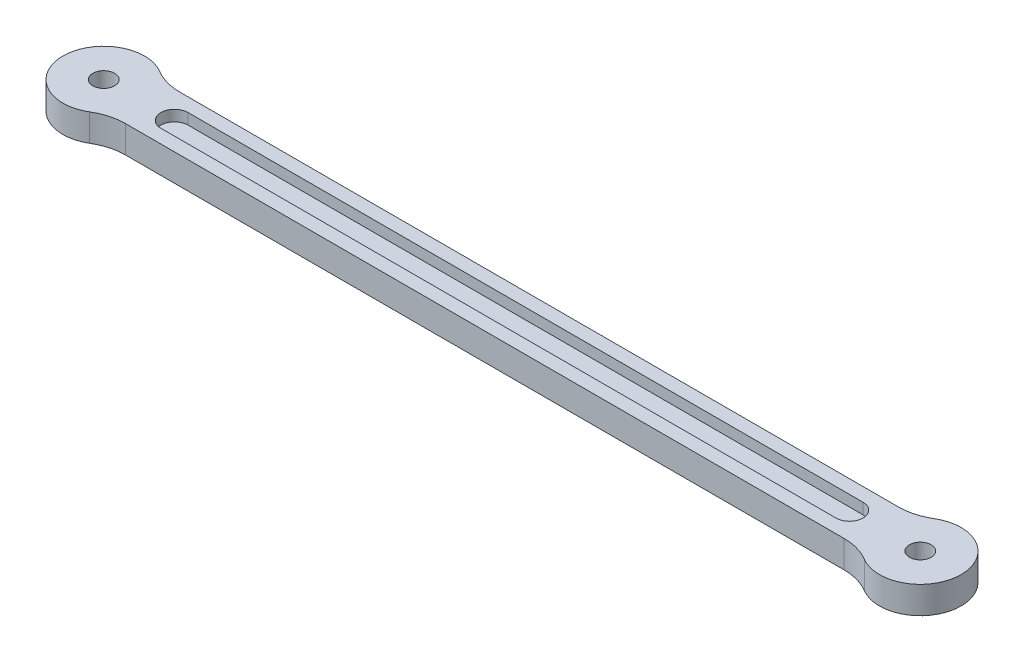
ISO-10303-21;
HEADER;
FILE_DESCRIPTION(('STEP AP214'),'2;1');
FILE_NAME('part.step','',(''),(''),'','','');
FILE_SCHEMA(('AUTOMOTIVE_DESIGN { 1 0 10303 214 1 1 1 1 }'));
ENDSEC;
DATA;
#1=APPLICATION_CONTEXT('core data for automotive mechanical design processes');
#2=APPLICATION_PROTOCOL_DEFINITION('international standard','automotive_design',2000,#1);
#3=PRODUCT_CONTEXT('',#1,'mechanical');
#4=PRODUCT('Part','Part','',(#3));
#5=PRODUCT_RELATED_PRODUCT_CATEGORY('part','',(#4));
#6=PRODUCT_DEFINITION_FORMATION('','',#4);
#7=PRODUCT_DEFINITION_CONTEXT('part definition',#1,'design');
#8=PRODUCT_DEFINITION('design','',#6,#7);
#9=PRODUCT_DEFINITION_SHAPE('','',#8);
#10=(LENGTH_UNIT() NAMED_UNIT(*) SI_UNIT(.MILLI.,.METRE.));
#11=(NAMED_UNIT(*) PLANE_ANGLE_UNIT() SI_UNIT($,.RADIAN.));
#12=(NAMED_UNIT(*) SI_UNIT($,.STERADIAN.) SOLID_ANGLE_UNIT());
#13=UNCERTAINTY_MEASURE_WITH_UNIT(LENGTH_MEASURE(1.E-05),#10,'distance_accuracy_value','');
#14=(GEOMETRIC_REPRESENTATION_CONTEXT(3) GLOBAL_UNCERTAINTY_ASSIGNED_CONTEXT((#13)) GLOBAL_UNIT_ASSIGNED_CONTEXT((#10,
#11,#12)) REPRESENTATION_CONTEXT('',''));
#15=CARTESIAN_POINT('',(0.,0.,0.));
#16=DIRECTION('',(0.,0.,1.));
#17=DIRECTION('',(1.,0.,0.));
#18=AXIS2_PLACEMENT_3D('',#15,#16,#17);
#19=CARTESIAN_POINT('',(63.2052229349355,5.,7.82303370786517));
#20=DIRECTION('',(0.,-1.,0.));
#21=DIRECTION('',(0.,0.,-1.));
#22=AXIS2_PLACEMENT_3D('',#19,#20,#21);
#23=PLANE('',#22);
#24=DIRECTION('',(1.,0.,0.));
#25=VECTOR('',#24,1.);
#26=CARTESIAN_POINT('',(-64.7808988764045,5.,-4.67696629213482));
#27=LINE('',#26,#25);
#28=CARTESIAN_POINT('',(-64.7808988764045,5.,-4.67696629213482));
#29=VERTEX_POINT('',#28);
#30=CARTESIAN_POINT('',(59.2191011235955,5.,-4.67696629213483));
#31=VERTEX_POINT('',#30);
#32=EDGE_CURVE('E225',#29,#31,#27,.T.);
#33=ORIENTED_EDGE('',*,*,#32,.F.);
#34=CARTESIAN_POINT('',(-64.7808988764045,5.,-7.17696629213483));
#35=DIRECTION('',(0.,1.,0.));
#36=DIRECTION('',(0.,0.,1.));
#37=AXIS2_PLACEMENT_3D('',#34,#35,#36);
#38=CIRCLE('',#37,2.50000000000001);
#39=CARTESIAN_POINT('',(-64.7808988764045,5.,-9.67696629213484));
#40=VERTEX_POINT('',#39);
#41=EDGE_CURVE('E52',#40,#29,#38,.T.);
#42=ORIENTED_EDGE('',*,*,#41,.F.);
#43=DIRECTION('',(-1.,0.,0.));
#44=VECTOR('',#43,1.);
#45=CARTESIAN_POINT('',(-64.7808988764045,5.,-9.67696629213484));
#46=LINE('',#45,#44);
#47=CARTESIAN_POINT('',(59.2191011235955,5.,-9.67696629213483));
#48=VERTEX_POINT('',#47);
#49=EDGE_CURVE('E218',#48,#40,#46,.T.);
#50=ORIENTED_EDGE('',*,*,#49,.F.);
#51=CARTESIAN_POINT('',(59.2191011235955,5.,-7.17696629213483));
#52=DIRECTION('',(0.,1.,0.));
#53=DIRECTION('',(0.,0.,1.));
#54=AXIS2_PLACEMENT_3D('',#51,#52,#53);
#55=CIRCLE('',#54,2.5);
#56=EDGE_CURVE('E222',#31,#48,#55,.T.);
#57=ORIENTED_EDGE('',*,*,#56,.F.);
#58=EDGE_LOOP('',(#33,#42,#50,#57));
#59=FACE_BOUND('',#58,.T.);
#60=CARTESIAN_POINT('',(63.2052229349355,5.,7.82303370786517));
#61=DIRECTION('',(0.,-1.,0.));
#62=DIRECTION('',(0.,0.,-1.));
#63=AXIS2_PLACEMENT_3D('',#60,#61,#62);
#64=CIRCLE('',#63,10.);
#65=CARTESIAN_POINT('',(63.2052229349355,5.,-2.17696629213483));
#66=VERTEX_POINT('',#65);
#67=CARTESIAN_POINT('',(68.3560104713126,5.,-0.748394863563402));
#68=VERTEX_POINT('',#67);
#69=EDGE_CURVE('E162',#66,#68,#64,.T.);
#70=ORIENTED_EDGE('',*,*,#69,.T.);
#71=CARTESIAN_POINT('',(72.2191011235955,5.,-7.17696629213483));
#72=DIRECTION('',(0.,1.,0.));
#73=DIRECTION('',(0.,0.,1.));
#74=AXIS2_PLACEMENT_3D('',#71,#72,#73);
#75=CIRCLE('',#74,7.5);
#76=CARTESIAN_POINT('',(68.3560104713126,5.,-13.6055377207063));
#77=VERTEX_POINT('',#76);
#78=EDGE_CURVE('E102',#68,#77,#75,.T.);
#79=ORIENTED_EDGE('',*,*,#78,.T.);
#80=CARTESIAN_POINT('',(63.2052229349355,5.,-22.1769662921348));
#81=DIRECTION('',(0.,-1.,0.));
#82=DIRECTION('',(0.,0.,1.));
#83=AXIS2_PLACEMENT_3D('',#80,#81,#82);
#84=CIRCLE('',#83,10.);
#85=CARTESIAN_POINT('',(63.2052229349355,5.,-12.1769662921348));
#86=VERTEX_POINT('',#85);
#87=EDGE_CURVE('E177',#77,#86,#84,.T.);
#88=ORIENTED_EDGE('',*,*,#87,.T.);
#89=DIRECTION('',(-1.,0.,0.));
#90=VECTOR('',#89,1.);
#91=CARTESIAN_POINT('',(-68.7670206877445,5.,-12.1769662921348));
#92=LINE('',#91,#90);
#93=CARTESIAN_POINT('',(-68.7670206877445,5.,-12.1769662921348));
#94=VERTEX_POINT('',#93);
#95=EDGE_CURVE('E190',#86,#94,#92,.T.);
#96=ORIENTED_EDGE('',*,*,#95,.T.);
#97=CARTESIAN_POINT('',(-68.7670206877445,5.,-22.1769662921348));
#98=DIRECTION('',(0.,-1.,0.));
#99=DIRECTION('',(0.,0.,-1.));
#100=AXIS2_PLACEMENT_3D('',#97,#98,#99);
#101=CIRCLE('',#100,10.);
#102=CARTESIAN_POINT('',(-73.9178082241217,5.,-13.6055377207063));
#103=VERTEX_POINT('',#102);
#104=EDGE_CURVE('E125',#94,#103,#101,.T.);
#105=ORIENTED_EDGE('',*,*,#104,.T.);
#106=CARTESIAN_POINT('',(-77.7808988764045,5.,-7.17696629213483));
#107=DIRECTION('',(0.,1.,0.));
#108=DIRECTION('',(0.,0.,1.));
#109=AXIS2_PLACEMENT_3D('',#106,#107,#108);
#110=CIRCLE('',#109,7.5);
#111=CARTESIAN_POINT('',(-73.9178082241217,5.,-0.748394863563404));
#112=VERTEX_POINT('',#111);
#113=EDGE_CURVE('E118',#103,#112,#110,.T.);
#114=ORIENTED_EDGE('',*,*,#113,.T.);
#115=CARTESIAN_POINT('',(-68.7670206877445,5.,7.82303370786517));
#116=DIRECTION('',(0.,-1.,0.));
#117=DIRECTION('',(0.,0.,1.));
#118=AXIS2_PLACEMENT_3D('',#115,#116,#117);
#119=CIRCLE('',#118,10.);
#120=CARTESIAN_POINT('',(-68.7670206877445,5.,-2.17696629213483));
#121=VERTEX_POINT('',#120);
#122=EDGE_CURVE('E122',#112,#121,#119,.T.);
#123=ORIENTED_EDGE('',*,*,#122,.T.);
#124=DIRECTION('',(1.,0.,0.));
#125=VECTOR('',#124,1.);
#126=CARTESIAN_POINT('',(-68.7670206877445,5.,-2.17696629213483));
#127=LINE('',#126,#125);
#128=EDGE_CURVE('E61',#121,#66,#127,.T.);
#129=ORIENTED_EDGE('',*,*,#128,.T.);
#130=EDGE_LOOP('',(#70,#79,#88,#96,#105,#114,#123,#129));
#131=FACE_BOUND('',#130,.T.);
#132=CARTESIAN_POINT('',(-77.7808988764045,5.,-7.17696629213483));
#133=DIRECTION('',(0.,1.,0.));
#134=DIRECTION('',(0.,0.,1.));
#135=AXIS2_PLACEMENT_3D('',#132,#133,#134);
#136=CIRCLE('',#135,2.);
#137=CARTESIAN_POINT('',(-77.7808988764045,5.,-5.17696629213483));
#138=VERTEX_POINT('',#137);
#139=EDGE_CURVE('E150',#138,#138,#136,.T.);
#140=ORIENTED_EDGE('',*,*,#139,.F.);
#141=EDGE_LOOP('',(#140));
#142=FACE_BOUND('',#141,.T.);
#143=CARTESIAN_POINT('',(72.2191011235955,5.,-7.17696629213483));
#144=DIRECTION('',(0.,1.,0.));
#145=DIRECTION('',(0.,0.,1.));
#146=AXIS2_PLACEMENT_3D('',#143,#144,#145);
#147=CIRCLE('',#146,2.);
#148=CARTESIAN_POINT('',(72.2191011235955,5.,-5.17696629213483));
#149=VERTEX_POINT('',#148);
#150=EDGE_CURVE('E199',#149,#149,#147,.T.);
#151=ORIENTED_EDGE('',*,*,#150,.F.);
#152=EDGE_LOOP('',(#151));
#153=FACE_BOUND('',#152,.T.);
#154=ADVANCED_FACE('F37',(#59,#131,#142,#153),#23,.F.);
#155=CARTESIAN_POINT('',(63.2052229349355,0.,7.82303370786517));
#156=DIRECTION('',(0.,-1.,0.));
#157=DIRECTION('',(0.,0.,-1.));
#158=AXIS2_PLACEMENT_3D('',#155,#156,#157);
#159=PLANE('',#158);
#160=CARTESIAN_POINT('',(-77.7808988764045,0.,-7.17696629213483));
#161=DIRECTION('',(0.,1.,0.));
#162=DIRECTION('',(0.,0.,1.));
#163=AXIS2_PLACEMENT_3D('',#160,#161,#162);
#164=CIRCLE('',#163,2.);
#165=CARTESIAN_POINT('',(-77.7808988764045,0.,-5.17696629213483));
#166=VERTEX_POINT('',#165);
#167=EDGE_CURVE('E196',#166,#166,#164,.T.);
#168=ORIENTED_EDGE('',*,*,#167,.T.);
#169=EDGE_LOOP('',(#168));
#170=FACE_BOUND('',#169,.T.);
#171=CARTESIAN_POINT('',(63.2052229349355,0.,7.82303370786517));
#172=DIRECTION('',(0.,-1.,0.));
#173=DIRECTION('',(0.,0.,-1.));
#174=AXIS2_PLACEMENT_3D('',#171,#172,#173);
#175=CIRCLE('',#174,10.);
#176=CARTESIAN_POINT('',(63.2052229349355,0.,-2.17696629213483));
#177=VERTEX_POINT('',#176);
#178=CARTESIAN_POINT('',(68.3560104713126,0.,-0.748394863563402));
#179=VERTEX_POINT('',#178);
#180=EDGE_CURVE('E146',#177,#179,#175,.T.);
#181=ORIENTED_EDGE('',*,*,#180,.F.);
#182=DIRECTION('',(1.,0.,0.));
#183=VECTOR('',#182,1.);
#184=CARTESIAN_POINT('',(-68.7670206877445,0.,-2.17696629213483));
#185=LINE('',#184,#183);
#186=CARTESIAN_POINT('',(-68.7670206877445,0.,-2.17696629213483));
#187=VERTEX_POINT('',#186);
#188=EDGE_CURVE('E94',#187,#177,#185,.T.);
#189=ORIENTED_EDGE('',*,*,#188,.F.);
#190=CARTESIAN_POINT('',(-68.7670206877445,0.,7.82303370786517));
#191=DIRECTION('',(0.,-1.,0.));
#192=DIRECTION('',(0.,0.,1.));
#193=AXIS2_PLACEMENT_3D('',#190,#191,#192);
#194=CIRCLE('',#193,10.);
#195=CARTESIAN_POINT('',(-73.9178082241217,0.,-0.748394863563404));
#196=VERTEX_POINT('',#195);
#197=EDGE_CURVE('E159',#196,#187,#194,.T.);
#198=ORIENTED_EDGE('',*,*,#197,.F.);
#199=CARTESIAN_POINT('',(-77.7808988764045,0.,-7.17696629213483));
#200=DIRECTION('',(0.,1.,0.));
#201=DIRECTION('',(0.,0.,1.));
#202=AXIS2_PLACEMENT_3D('',#199,#200,#201);
#203=CIRCLE('',#202,7.5);
#204=CARTESIAN_POINT('',(-73.9178082241217,0.,-13.6055377207063));
#205=VERTEX_POINT('',#204);
#206=EDGE_CURVE('E134',#205,#196,#203,.T.);
#207=ORIENTED_EDGE('',*,*,#206,.F.);
#208=CARTESIAN_POINT('',(-68.7670206877445,0.,-22.1769662921348));
#209=DIRECTION('',(0.,-1.,0.));
#210=DIRECTION('',(0.,0.,-1.));
#211=AXIS2_PLACEMENT_3D('',#208,#209,#210);
#212=CIRCLE('',#211,10.);
#213=CARTESIAN_POINT('',(-68.7670206877445,0.,-12.1769662921348));
#214=VERTEX_POINT('',#213);
#215=EDGE_CURVE('E156',#214,#205,#212,.T.);
#216=ORIENTED_EDGE('',*,*,#215,.F.);
#217=DIRECTION('',(-1.,0.,0.));
#218=VECTOR('',#217,1.);
#219=CARTESIAN_POINT('',(-68.7670206877445,0.,-12.1769662921348));
#220=LINE('',#219,#218);
#221=CARTESIAN_POINT('',(63.2052229349355,0.,-12.1769662921348));
#222=VERTEX_POINT('',#221);
#223=EDGE_CURVE('E154',#222,#214,#220,.T.);
#224=ORIENTED_EDGE('',*,*,#223,.F.);
#225=CARTESIAN_POINT('',(63.2052229349355,0.,-22.1769662921348));
#226=DIRECTION('',(0.,-1.,0.));
#227=DIRECTION('',(0.,0.,1.));
#228=AXIS2_PLACEMENT_3D('',#225,#226,#227);
#229=CIRCLE('',#228,10.);
#230=CARTESIAN_POINT('',(68.3560104713126,0.,-13.6055377207063));
#231=VERTEX_POINT('',#230);
#232=EDGE_CURVE('E152',#231,#222,#229,.T.);
#233=ORIENTED_EDGE('',*,*,#232,.F.);
#234=CARTESIAN_POINT('',(72.2191011235955,0.,-7.17696629213483));
#235=DIRECTION('',(0.,1.,0.));
#236=DIRECTION('',(0.,0.,1.));
#237=AXIS2_PLACEMENT_3D('',#234,#235,#236);
#238=CIRCLE('',#237,7.5);
#239=EDGE_CURVE('E149',#179,#231,#238,.T.);
#240=ORIENTED_EDGE('',*,*,#239,.F.);
#241=EDGE_LOOP('',(#181,#189,#198,#207,#216,#224,#233,#240));
#242=FACE_BOUND('',#241,.T.);
#243=CARTESIAN_POINT('',(72.2191011235955,0.,-7.17696629213483));
#244=DIRECTION('',(0.,1.,0.));
#245=DIRECTION('',(0.,0.,1.));
#246=AXIS2_PLACEMENT_3D('',#243,#244,#245);
#247=CIRCLE('',#246,2.);
#248=CARTESIAN_POINT('',(72.2191011235955,0.,-5.17696629213483));
#249=VERTEX_POINT('',#248);
#250=EDGE_CURVE('E202',#249,#249,#247,.T.);
#251=ORIENTED_EDGE('',*,*,#250,.T.);
#252=EDGE_LOOP('',(#251));
#253=FACE_BOUND('',#252,.T.);
#254=ADVANCED_FACE('F181',(#170,#242,#253),#159,.T.);
#255=CARTESIAN_POINT('',(63.2052229349355,5.,7.82303370786517));
#256=DIRECTION('',(0.,-1.,0.));
#257=DIRECTION('',(0.,0.,-1.));
#258=AXIS2_PLACEMENT_3D('',#255,#256,#257);
#259=CYLINDRICAL_SURFACE('',#258,10.);
#260=ORIENTED_EDGE('',*,*,#180,.T.);
#261=DIRECTION('',(0.,-1.,0.));
#262=VECTOR('',#261,1.);
#263=CARTESIAN_POINT('',(68.3560104713126,5.,-0.748394863563402));
#264=LINE('',#263,#262);
#265=EDGE_CURVE('E11',#68,#179,#264,.T.);
#266=ORIENTED_EDGE('',*,*,#265,.F.);
#267=ORIENTED_EDGE('',*,*,#69,.F.);
#268=DIRECTION('',(0.,-1.,0.));
#269=VECTOR('',#268,1.);
#270=CARTESIAN_POINT('',(63.2052229349355,5.,-2.17696629213483));
#271=LINE('',#270,#269);
#272=EDGE_CURVE('E142',#66,#177,#271,.T.);
#273=ORIENTED_EDGE('',*,*,#272,.T.);
#274=EDGE_LOOP('',(#260,#266,#267,#273));
#275=FACE_BOUND('',#274,.T.);
#276=ADVANCED_FACE('F39',(#275),#259,.F.);
#277=CARTESIAN_POINT('',(72.2191011235955,5.,-7.17696629213483));
#278=DIRECTION('',(0.,-1.,0.));
#279=DIRECTION('',(0.,0.,-1.));
#280=AXIS2_PLACEMENT_3D('',#277,#278,#279);
#281=CYLINDRICAL_SURFACE('',#280,7.5);
#282=ORIENTED_EDGE('',*,*,#239,.T.);
#283=DIRECTION('',(0.,-1.,0.));
#284=VECTOR('',#283,1.);
#285=CARTESIAN_POINT('',(68.3560104713126,5.,-13.6055377207063));
#286=LINE('',#285,#284);
#287=EDGE_CURVE('E45',#77,#231,#286,.T.);
#288=ORIENTED_EDGE('',*,*,#287,.F.);
#289=ORIENTED_EDGE('',*,*,#78,.F.);
#290=ORIENTED_EDGE('',*,*,#265,.T.);
#291=EDGE_LOOP('',(#282,#288,#289,#290));
#292=FACE_BOUND('',#291,.T.);
#293=ADVANCED_FACE('F300',(#292),#281,.T.);
#294=CARTESIAN_POINT('',(63.2052229349355,5.,-22.1769662921348));
#295=DIRECTION('',(0.,-1.,0.));
#296=DIRECTION('',(0.,0.,-1.));
#297=AXIS2_PLACEMENT_3D('',#294,#295,#296);
#298=CYLINDRICAL_SURFACE('',#297,10.);
#299=ORIENTED_EDGE('',*,*,#232,.T.);
#300=DIRECTION('',(0.,-1.,0.));
#301=VECTOR('',#300,1.);
#302=CARTESIAN_POINT('',(63.2052229349355,5.,-12.1769662921348));
#303=LINE('',#302,#301);
#304=EDGE_CURVE('E169',#86,#222,#303,.T.);
#305=ORIENTED_EDGE('',*,*,#304,.F.);
#306=ORIENTED_EDGE('',*,*,#87,.F.);
#307=ORIENTED_EDGE('',*,*,#287,.T.);
#308=EDGE_LOOP('',(#299,#305,#306,#307));
#309=FACE_BOUND('',#308,.T.);
#310=ADVANCED_FACE('F175',(#309),#298,.F.);
#311=CARTESIAN_POINT('',(-68.7670206877445,5.,-12.1769662921348));
#312=DIRECTION('',(0.,0.,1.));
#313=DIRECTION('',(1.,0.,0.));
#314=AXIS2_PLACEMENT_3D('',#311,#312,#313);
#315=PLANE('',#314);
#316=ORIENTED_EDGE('',*,*,#223,.T.);
#317=DIRECTION('',(0.,-1.,0.));
#318=VECTOR('',#317,1.);
#319=CARTESIAN_POINT('',(-68.7670206877445,5.,-12.1769662921348));
#320=LINE('',#319,#318);
#321=EDGE_CURVE('E166',#94,#214,#320,.T.);
#322=ORIENTED_EDGE('',*,*,#321,.F.);
#323=ORIENTED_EDGE('',*,*,#95,.F.);
#324=ORIENTED_EDGE('',*,*,#304,.T.);
#325=EDGE_LOOP('',(#316,#322,#323,#324));
#326=FACE_BOUND('',#325,.T.);
#327=ADVANCED_FACE('F186',(#326),#315,.F.);
#328=CARTESIAN_POINT('',(-68.7670206877445,5.,-22.1769662921348));
#329=DIRECTION('',(0.,-1.,0.));
#330=DIRECTION('',(0.,0.,-1.));
#331=AXIS2_PLACEMENT_3D('',#328,#329,#330);
#332=CYLINDRICAL_SURFACE('',#331,10.);
#333=ORIENTED_EDGE('',*,*,#215,.T.);
#334=DIRECTION('',(0.,-1.,0.));
#335=VECTOR('',#334,1.);
#336=CARTESIAN_POINT('',(-73.9178082241217,5.,-13.6055377207063));
#337=LINE('',#336,#335);
#338=EDGE_CURVE('E137',#103,#205,#337,.T.);
#339=ORIENTED_EDGE('',*,*,#338,.F.);
#340=ORIENTED_EDGE('',*,*,#104,.F.);
#341=ORIENTED_EDGE('',*,*,#321,.T.);
#342=EDGE_LOOP('',(#333,#339,#340,#341));
#343=FACE_BOUND('',#342,.T.);
#344=ADVANCED_FACE('F189',(#343),#332,.F.);
#345=CARTESIAN_POINT('',(-77.7808988764045,5.,-7.17696629213483));
#346=DIRECTION('',(0.,-1.,0.));
#347=DIRECTION('',(0.,0.,-1.));
#348=AXIS2_PLACEMENT_3D('',#345,#346,#347);
#349=CYLINDRICAL_SURFACE('',#348,7.5);
#350=ORIENTED_EDGE('',*,*,#206,.T.);
#351=DIRECTION('',(0.,-1.,0.));
#352=VECTOR('',#351,1.);
#353=CARTESIAN_POINT('',(-73.9178082241217,5.,-0.748394863563404));
#354=LINE('',#353,#352);
#355=EDGE_CURVE('E131',#112,#196,#354,.T.);
#356=ORIENTED_EDGE('',*,*,#355,.F.);
#357=ORIENTED_EDGE('',*,*,#113,.F.);
#358=ORIENTED_EDGE('',*,*,#338,.T.);
#359=EDGE_LOOP('',(#350,#356,#357,#358));
#360=FACE_BOUND('',#359,.T.);
#361=ADVANCED_FACE('F132',(#360),#349,.T.);
#362=CARTESIAN_POINT('',(-68.7670206877445,5.,7.82303370786517));
#363=DIRECTION('',(0.,-1.,0.));
#364=DIRECTION('',(0.,0.,-1.));
#365=AXIS2_PLACEMENT_3D('',#362,#363,#364);
#366=CYLINDRICAL_SURFACE('',#365,10.);
#367=ORIENTED_EDGE('',*,*,#197,.T.);
#368=DIRECTION('',(0.,-1.,0.));
#369=VECTOR('',#368,1.);
#370=CARTESIAN_POINT('',(-68.7670206877445,5.,-2.17696629213483));
#371=LINE('',#370,#369);
#372=EDGE_CURVE('E138',#121,#187,#371,.T.);
#373=ORIENTED_EDGE('',*,*,#372,.F.);
#374=ORIENTED_EDGE('',*,*,#122,.F.);
#375=ORIENTED_EDGE('',*,*,#355,.T.);
#376=EDGE_LOOP('',(#367,#373,#374,#375));
#377=FACE_BOUND('',#376,.T.);
#378=ADVANCED_FACE('F140',(#377),#366,.F.);
#379=CARTESIAN_POINT('',(-68.7670206877445,5.,-2.17696629213483));
#380=DIRECTION('',(0.,0.,-1.));
#381=DIRECTION('',(-1.,0.,0.));
#382=AXIS2_PLACEMENT_3D('',#379,#380,#381);
#383=PLANE('',#382);
#384=ORIENTED_EDGE('',*,*,#188,.T.);
#385=ORIENTED_EDGE('',*,*,#272,.F.);
#386=ORIENTED_EDGE('',*,*,#128,.F.);
#387=ORIENTED_EDGE('',*,*,#372,.T.);
#388=EDGE_LOOP('',(#384,#385,#386,#387));
#389=FACE_BOUND('',#388,.T.);
#390=ADVANCED_FACE('F288',(#389),#383,.F.);
#391=CARTESIAN_POINT('',(-77.7808988764045,5.,-7.17696629213483));
#392=DIRECTION('',(0.,-1.,0.));
#393=DIRECTION('',(0.,0.,-1.));
#394=AXIS2_PLACEMENT_3D('',#391,#392,#393);
#395=CYLINDRICAL_SURFACE('',#394,2.);
#396=ORIENTED_EDGE('',*,*,#139,.T.);
#397=EDGE_LOOP('',(#396));
#398=FACE_BOUND('',#397,.T.);
#399=ORIENTED_EDGE('',*,*,#167,.F.);
#400=EDGE_LOOP('',(#399));
#401=FACE_BOUND('',#400,.T.);
#402=ADVANCED_FACE('F285',(#398,#401),#395,.F.);
#403=CARTESIAN_POINT('',(72.2191011235955,5.,-7.17696629213483));
#404=DIRECTION('',(0.,-1.,0.));
#405=DIRECTION('',(0.,0.,-1.));
#406=AXIS2_PLACEMENT_3D('',#403,#404,#405);
#407=CYLINDRICAL_SURFACE('',#406,2.);
#408=ORIENTED_EDGE('',*,*,#150,.T.);
#409=EDGE_LOOP('',(#408));
#410=FACE_BOUND('',#409,.T.);
#411=ORIENTED_EDGE('',*,*,#250,.F.);
#412=EDGE_LOOP('',(#411));
#413=FACE_BOUND('',#412,.T.);
#414=ADVANCED_FACE('F363',(#410,#413),#407,.F.);
#415=CARTESIAN_POINT('',(-64.7808988764045,3.,-7.17696629213483));
#416=DIRECTION('',(0.,1.,0.));
#417=DIRECTION('',(0.,0.,1.));
#418=AXIS2_PLACEMENT_3D('',#415,#416,#417);
#419=CYLINDRICAL_SURFACE('',#418,2.50000000000001);
#420=ORIENTED_EDGE('',*,*,#41,.T.);
#421=DIRECTION('',(0.,1.,0.));
#422=VECTOR('',#421,1.);
#423=CARTESIAN_POINT('',(-64.7808988764045,3.,-4.67696629213482));
#424=LINE('',#423,#422);
#425=CARTESIAN_POINT('',(-64.7808988764045,3.,-4.67696629213482));
#426=VERTEX_POINT('',#425);
#427=EDGE_CURVE('E208',#426,#29,#424,.T.);
#428=ORIENTED_EDGE('',*,*,#427,.F.);
#429=CARTESIAN_POINT('',(-64.7808988764045,3.,-7.17696629213483));
#430=DIRECTION('',(0.,1.,0.));
#431=DIRECTION('',(0.,0.,1.));
#432=AXIS2_PLACEMENT_3D('',#429,#430,#431);
#433=CIRCLE('',#432,2.50000000000001);
#434=CARTESIAN_POINT('',(-64.7808988764045,3.,-9.67696629213484));
#435=VERTEX_POINT('',#434);
#436=EDGE_CURVE('E221',#435,#426,#433,.T.);
#437=ORIENTED_EDGE('',*,*,#436,.F.);
#438=DIRECTION('',(0.,1.,0.));
#439=VECTOR('',#438,1.);
#440=CARTESIAN_POINT('',(-64.7808988764045,3.,-9.67696629213484));
#441=LINE('',#440,#439);
#442=EDGE_CURVE('E205',#435,#40,#441,.T.);
#443=ORIENTED_EDGE('',*,*,#442,.T.);
#444=EDGE_LOOP('',(#420,#428,#437,#443));
#445=FACE_BOUND('',#444,.T.);
#446=ADVANCED_FACE('F246',(#445),#419,.F.);
#447=CARTESIAN_POINT('',(-64.7808988764045,3.,-9.67696629213484));
#448=DIRECTION('',(0.,0.,-1.));
#449=DIRECTION('',(-1.,0.,0.));
#450=AXIS2_PLACEMENT_3D('',#447,#448,#449);
#451=PLANE('',#450);
#452=ORIENTED_EDGE('',*,*,#49,.T.);
#453=ORIENTED_EDGE('',*,*,#442,.F.);
#454=DIRECTION('',(-1.,0.,0.));
#455=VECTOR('',#454,1.);
#456=CARTESIAN_POINT('',(-64.7808988764045,3.,-9.67696629213484));
#457=LINE('',#456,#455);
#458=CARTESIAN_POINT('',(59.2191011235955,3.,-9.67696629213483));
#459=VERTEX_POINT('',#458);
#460=EDGE_CURVE('E211',#459,#435,#457,.T.);
#461=ORIENTED_EDGE('',*,*,#460,.F.);
#462=DIRECTION('',(0.,1.,0.));
#463=VECTOR('',#462,1.);
#464=CARTESIAN_POINT('',(59.2191011235955,3.,-9.67696629213483));
#465=LINE('',#464,#463);
#466=EDGE_CURVE('E214',#459,#48,#465,.T.);
#467=ORIENTED_EDGE('',*,*,#466,.T.);
#468=EDGE_LOOP('',(#452,#453,#461,#467));
#469=FACE_BOUND('',#468,.T.);
#470=ADVANCED_FACE('F257',(#469),#451,.F.);
#471=CARTESIAN_POINT('',(59.2191011235955,3.,-7.17696629213483));
#472=DIRECTION('',(0.,1.,0.));
#473=DIRECTION('',(0.,0.,1.));
#474=AXIS2_PLACEMENT_3D('',#471,#472,#473);
#475=CYLINDRICAL_SURFACE('',#474,2.5);
#476=ORIENTED_EDGE('',*,*,#56,.T.);
#477=ORIENTED_EDGE('',*,*,#466,.F.);
#478=CARTESIAN_POINT('',(59.2191011235955,3.,-7.17696629213483));
#479=DIRECTION('',(0.,1.,0.));
#480=DIRECTION('',(0.,0.,1.));
#481=AXIS2_PLACEMENT_3D('',#478,#479,#480);
#482=CIRCLE('',#481,2.5);
#483=CARTESIAN_POINT('',(59.2191011235955,3.,-4.67696629213483));
#484=VERTEX_POINT('',#483);
#485=EDGE_CURVE('E231',#484,#459,#482,.T.);
#486=ORIENTED_EDGE('',*,*,#485,.F.);
#487=DIRECTION('',(0.,1.,0.));
#488=VECTOR('',#487,1.);
#489=CARTESIAN_POINT('',(59.2191011235955,3.,-4.67696629213483));
#490=LINE('',#489,#488);
#491=EDGE_CURVE('E210',#484,#31,#490,.T.);
#492=ORIENTED_EDGE('',*,*,#491,.T.);
#493=EDGE_LOOP('',(#476,#477,#486,#492));
#494=FACE_BOUND('',#493,.T.);
#495=ADVANCED_FACE('F262',(#494),#475,.F.);
#496=CARTESIAN_POINT('',(-64.7808988764045,3.,-4.67696629213482));
#497=DIRECTION('',(0.,0.,1.));
#498=DIRECTION('',(1.,0.,0.));
#499=AXIS2_PLACEMENT_3D('',#496,#497,#498);
#500=PLANE('',#499);
#501=ORIENTED_EDGE('',*,*,#32,.T.);
#502=ORIENTED_EDGE('',*,*,#491,.F.);
#503=DIRECTION('',(1.,0.,0.));
#504=VECTOR('',#503,1.);
#505=CARTESIAN_POINT('',(-64.7808988764045,3.,-4.67696629213482));
#506=LINE('',#505,#504);
#507=EDGE_CURVE('E234',#426,#484,#506,.T.);
#508=ORIENTED_EDGE('',*,*,#507,.F.);
#509=ORIENTED_EDGE('',*,*,#427,.T.);
#510=EDGE_LOOP('',(#501,#502,#508,#509));
#511=FACE_BOUND('',#510,.T.);
#512=ADVANCED_FACE('F267',(#511),#500,.F.);
#513=CARTESIAN_POINT('',(-64.7808988764045,3.,-7.17696629213483));
#514=DIRECTION('',(0.,1.,0.));
#515=DIRECTION('',(0.,0.,1.));
#516=AXIS2_PLACEMENT_3D('',#513,#514,#515);
#517=PLANE('',#516);
#518=ORIENTED_EDGE('',*,*,#436,.T.);
#519=ORIENTED_EDGE('',*,*,#507,.T.);
#520=ORIENTED_EDGE('',*,*,#485,.T.);
#521=ORIENTED_EDGE('',*,*,#460,.T.);
#522=EDGE_LOOP('',(#518,#519,#520,#521));
#523=FACE_BOUND('',#522,.T.);
#524=ADVANCED_FACE('F241',(#523),#517,.T.);
#525=CLOSED_SHELL('',(#154,#254,#276,#293,#310,#327,#344,#361,#378,#390,#402,#414,#446,#470,
#495,#512,#524));
#526=MANIFOLD_SOLID_BREP('B2',#525);
#527=ADVANCED_BREP_SHAPE_REPRESENTATION('',(#18,#526),#14);
#528=SHAPE_DEFINITION_REPRESENTATION(#9,#527);
ENDSEC;
END-ISO-10303-21;
